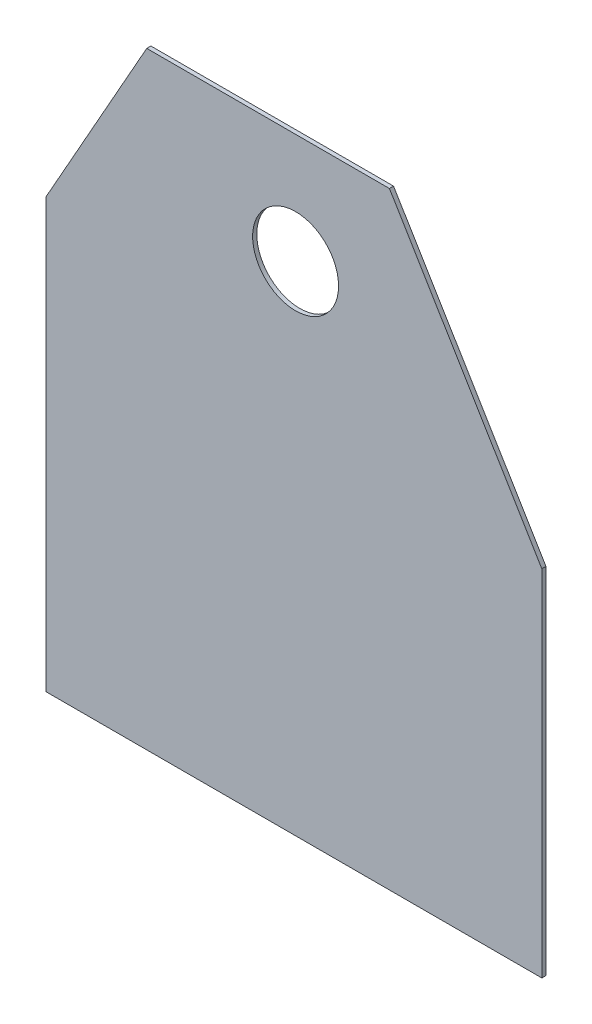
ISO-10303-21;
HEADER;
FILE_DESCRIPTION(('STEP AP214'),'2;1');
FILE_NAME('part.step','',(''),(''),'','','');
FILE_SCHEMA(('AUTOMOTIVE_DESIGN { 1 0 10303 214 1 1 1 1 }'));
ENDSEC;
DATA;
#1=APPLICATION_CONTEXT('core data for automotive mechanical design processes');
#2=APPLICATION_PROTOCOL_DEFINITION('international standard','automotive_design',2000,#1);
#3=PRODUCT_CONTEXT('',#1,'mechanical');
#4=PRODUCT('Part','Part','',(#3));
#5=PRODUCT_RELATED_PRODUCT_CATEGORY('part','',(#4));
#6=PRODUCT_DEFINITION_FORMATION('','',#4);
#7=PRODUCT_DEFINITION_CONTEXT('part definition',#1,'design');
#8=PRODUCT_DEFINITION('design','',#6,#7);
#9=PRODUCT_DEFINITION_SHAPE('','',#8);
#10=(LENGTH_UNIT() NAMED_UNIT(*) SI_UNIT(.MILLI.,.METRE.));
#11=(NAMED_UNIT(*) PLANE_ANGLE_UNIT() SI_UNIT($,.RADIAN.));
#12=(NAMED_UNIT(*) SI_UNIT($,.STERADIAN.) SOLID_ANGLE_UNIT());
#13=UNCERTAINTY_MEASURE_WITH_UNIT(LENGTH_MEASURE(1.E-05),#10,'distance_accuracy_value','');
#14=(GEOMETRIC_REPRESENTATION_CONTEXT(3) GLOBAL_UNCERTAINTY_ASSIGNED_CONTEXT((#13)) GLOBAL_UNIT_ASSIGNED_CONTEXT((#10,
#11,#12)) REPRESENTATION_CONTEXT('',''));
#15=CARTESIAN_POINT('',(0.,0.,0.));
#16=DIRECTION('',(0.,0.,1.));
#17=DIRECTION('',(1.,0.,0.));
#18=AXIS2_PLACEMENT_3D('',#15,#16,#17);
#19=CARTESIAN_POINT('',(3.99997789903306,367.746913543779,2.5));
#20=DIRECTION('',(0.,0.,-1.));
#21=DIRECTION('',(-1.,0.,0.));
#22=AXIS2_PLACEMENT_3D('',#19,#20,#21);
#23=PLANE('',#22);
#24=DIRECTION('',(6.00983079582808E-08,-0.999999999999998,0.));
#25=VECTOR('',#24,1.);
#26=CARTESIAN_POINT('',(4.00000000000009,3.86954190911837E-06,2.5));
#27=LINE('',#26,#25);
#28=CARTESIAN_POINT('',(3.99998440595974,259.475534380179,2.5));
#29=VERTEX_POINT('',#28);
#30=CARTESIAN_POINT('',(4.00000000000009,3.86954190911837E-06,2.5));
#31=VERTEX_POINT('',#30);
#32=EDGE_CURVE('E127',#29,#31,#27,.T.);
#33=ORIENTED_EDGE('',*,*,#32,.T.);
#34=DIRECTION('',(1.,0.,0.));
#35=VECTOR('',#34,1.);
#36=CARTESIAN_POINT('',(4.00000000000009,3.86954190911837E-06,2.5));
#37=LINE('',#36,#35);
#38=CARTESIAN_POINT('',(304.134993214093,3.86954190911837E-06,2.5));
#39=VERTEX_POINT('',#38);
#40=EDGE_CURVE('E85',#31,#39,#37,.T.);
#41=ORIENTED_EDGE('',*,*,#40,.T.);
#42=DIRECTION('',(-6.28185821949425E-08,0.999999999999998,0.));
#43=VECTOR('',#42,1.);
#44=CARTESIAN_POINT('',(304.134993214093,3.86954190911837E-06,2.5));
#45=LINE('',#44,#43);
#46=CARTESIAN_POINT('',(304.134979737587,214.530564139705,2.5));
#47=VERTEX_POINT('',#46);
#48=EDGE_CURVE('E98',#39,#47,#45,.T.);
#49=ORIENTED_EDGE('',*,*,#48,.T.);
#50=DIRECTION('',(-0.515823661860529,0.85669478220939,0.));
#51=VECTOR('',#50,1.);
#52=CARTESIAN_POINT('',(211.88202676087,367.746923337921,2.5));
#53=LINE('',#52,#51);
#54=CARTESIAN_POINT('',(211.88202676087,367.746923337921,2.5));
#55=VERTEX_POINT('',#54);
#56=EDGE_CURVE('E92',#47,#55,#53,.T.);
#57=ORIENTED_EDGE('',*,*,#56,.T.);
#58=DIRECTION('',(-0.999999999999999,-4.71139368803133E-08,0.));
#59=VECTOR('',#58,1.);
#60=CARTESIAN_POINT('',(64.9764614058707,367.746916416621,2.5));
#61=LINE('',#60,#59);
#62=CARTESIAN_POINT('',(64.9764614058707,367.746916416621,2.5));
#63=VERTEX_POINT('',#62);
#64=EDGE_CURVE('E96',#55,#63,#61,.T.);
#65=ORIENTED_EDGE('',*,*,#64,.T.);
#66=DIRECTION('',(-0.49071248496119,-0.871321557809294,0.));
#67=VECTOR('',#66,1.);
#68=CARTESIAN_POINT('',(64.9764614058707,367.746916416621,2.5));
#69=LINE('',#68,#67);
#70=EDGE_CURVE('E48',#63,#29,#69,.T.);
#71=ORIENTED_EDGE('',*,*,#70,.T.);
#72=EDGE_LOOP('',(#33,#41,#49,#57,#65,#71));
#73=FACE_BOUND('',#72,.T.);
#74=CARTESIAN_POINT('',(155.072501178547,301.231243192497,2.5));
#75=DIRECTION('',(0.,0.,1.));
#76=DIRECTION('',(1.,0.,0.));
#77=AXIS2_PLACEMENT_3D('',#74,#75,#76);
#78=CIRCLE('',#77,25.9999999999985);
#79=CARTESIAN_POINT('',(181.072501178546,301.231243192497,2.5));
#80=VERTEX_POINT('',#79);
#81=EDGE_CURVE('E120',#80,#80,#78,.T.);
#82=ORIENTED_EDGE('',*,*,#81,.F.);
#83=EDGE_LOOP('',(#82));
#84=FACE_BOUND('',#83,.T.);
#85=ADVANCED_FACE('F31',(#73,#84),#23,.F.);
#86=CARTESIAN_POINT('',(3.99997789903306,367.746913543779,0.));
#87=DIRECTION('',(0.,0.,-1.));
#88=DIRECTION('',(-1.,0.,0.));
#89=AXIS2_PLACEMENT_3D('',#86,#87,#88);
#90=PLANE('',#89);
#91=DIRECTION('',(6.00983079582808E-08,-0.999999999999998,0.));
#92=VECTOR('',#91,1.);
#93=CARTESIAN_POINT('',(4.00000000000009,3.86954190911837E-06,0.));
#94=LINE('',#93,#92);
#95=CARTESIAN_POINT('',(3.99998440595974,259.475534380179,0.));
#96=VERTEX_POINT('',#95);
#97=CARTESIAN_POINT('',(4.00000000000009,3.86954190911837E-06,0.));
#98=VERTEX_POINT('',#97);
#99=EDGE_CURVE('E116',#96,#98,#94,.T.);
#100=ORIENTED_EDGE('',*,*,#99,.F.);
#101=DIRECTION('',(-0.49071248496119,-0.871321557809294,0.));
#102=VECTOR('',#101,1.);
#103=CARTESIAN_POINT('',(64.9764614058707,367.746916416621,0.));
#104=LINE('',#103,#102);
#105=CARTESIAN_POINT('',(64.9764614058707,367.746916416621,0.));
#106=VERTEX_POINT('',#105);
#107=EDGE_CURVE('E77',#106,#96,#104,.T.);
#108=ORIENTED_EDGE('',*,*,#107,.F.);
#109=DIRECTION('',(-0.999999999999999,-4.71139368803133E-08,0.));
#110=VECTOR('',#109,1.);
#111=CARTESIAN_POINT('',(64.9764614058707,367.746916416621,0.));
#112=LINE('',#111,#110);
#113=CARTESIAN_POINT('',(211.88202676087,367.746923337921,0.));
#114=VERTEX_POINT('',#113);
#115=EDGE_CURVE('E71',#114,#106,#112,.T.);
#116=ORIENTED_EDGE('',*,*,#115,.F.);
#117=DIRECTION('',(-0.515823661860529,0.85669478220939,0.));
#118=VECTOR('',#117,1.);
#119=CARTESIAN_POINT('',(211.88202676087,367.746923337921,0.));
#120=LINE('',#119,#118);
#121=CARTESIAN_POINT('',(304.134979737587,214.530564139705,0.));
#122=VERTEX_POINT('',#121);
#123=EDGE_CURVE('E106',#122,#114,#120,.T.);
#124=ORIENTED_EDGE('',*,*,#123,.F.);
#125=DIRECTION('',(-6.28185821949425E-08,0.999999999999998,0.));
#126=VECTOR('',#125,1.);
#127=CARTESIAN_POINT('',(304.134993214093,3.86954190911837E-06,0.));
#128=LINE('',#127,#126);
#129=CARTESIAN_POINT('',(304.134993214093,3.86954190911837E-06,0.));
#130=VERTEX_POINT('',#129);
#131=EDGE_CURVE('E122',#130,#122,#128,.T.);
#132=ORIENTED_EDGE('',*,*,#131,.F.);
#133=DIRECTION('',(1.,0.,0.));
#134=VECTOR('',#133,1.);
#135=CARTESIAN_POINT('',(4.00000000000009,3.86954190911837E-06,0.));
#136=LINE('',#135,#134);
#137=EDGE_CURVE('E119',#98,#130,#136,.T.);
#138=ORIENTED_EDGE('',*,*,#137,.F.);
#139=EDGE_LOOP('',(#100,#108,#116,#124,#132,#138));
#140=FACE_BOUND('',#139,.T.);
#141=CARTESIAN_POINT('',(155.072501178547,301.231243192497,0.));
#142=DIRECTION('',(0.,0.,1.));
#143=DIRECTION('',(1.,0.,0.));
#144=AXIS2_PLACEMENT_3D('',#141,#142,#143);
#145=CIRCLE('',#144,25.9999999999985);
#146=CARTESIAN_POINT('',(181.072501178546,301.231243192497,0.));
#147=VERTEX_POINT('',#146);
#148=EDGE_CURVE('E220',#147,#147,#145,.T.);
#149=ORIENTED_EDGE('',*,*,#148,.T.);
#150=EDGE_LOOP('',(#149));
#151=FACE_BOUND('',#150,.T.);
#152=ADVANCED_FACE('F136',(#140,#151),#90,.T.);
#153=CARTESIAN_POINT('',(4.00000000000009,3.86954190911837E-06,2.5));
#154=DIRECTION('',(0.999999999999998,6.00983079582808E-08,0.));
#155=DIRECTION('',(-6.00983079582808E-08,0.999999999999998,0.));
#156=AXIS2_PLACEMENT_3D('',#153,#154,#155);
#157=PLANE('',#156);
#158=ORIENTED_EDGE('',*,*,#99,.T.);
#159=DIRECTION('',(0.,0.,-1.));
#160=VECTOR('',#159,1.);
#161=CARTESIAN_POINT('',(4.00000000000009,3.86954190911837E-06,2.5));
#162=LINE('',#161,#160);
#163=EDGE_CURVE('E11',#31,#98,#162,.T.);
#164=ORIENTED_EDGE('',*,*,#163,.F.);
#165=ORIENTED_EDGE('',*,*,#32,.F.);
#166=DIRECTION('',(0.,0.,-1.));
#167=VECTOR('',#166,1.);
#168=CARTESIAN_POINT('',(3.99998440595974,259.475534380179,2.5));
#169=LINE('',#168,#167);
#170=EDGE_CURVE('E112',#29,#96,#169,.T.);
#171=ORIENTED_EDGE('',*,*,#170,.T.);
#172=EDGE_LOOP('',(#158,#164,#165,#171));
#173=FACE_BOUND('',#172,.T.);
#174=ADVANCED_FACE('F33',(#173),#157,.F.);
#175=CARTESIAN_POINT('',(4.00000000000009,3.86954190911837E-06,2.5));
#176=DIRECTION('',(0.,1.,0.));
#177=DIRECTION('',(0.,0.,1.));
#178=AXIS2_PLACEMENT_3D('',#175,#176,#177);
#179=PLANE('',#178);
#180=ORIENTED_EDGE('',*,*,#137,.T.);
#181=DIRECTION('',(0.,0.,-1.));
#182=VECTOR('',#181,1.);
#183=CARTESIAN_POINT('',(304.134993214093,3.86954190911837E-06,2.5));
#184=LINE('',#183,#182);
#185=EDGE_CURVE('E40',#39,#130,#184,.T.);
#186=ORIENTED_EDGE('',*,*,#185,.F.);
#187=ORIENTED_EDGE('',*,*,#40,.F.);
#188=ORIENTED_EDGE('',*,*,#163,.T.);
#189=EDGE_LOOP('',(#180,#186,#187,#188));
#190=FACE_BOUND('',#189,.T.);
#191=ADVANCED_FACE('F161',(#190),#179,.F.);
#192=CARTESIAN_POINT('',(304.134993214093,3.86954190911837E-06,2.5));
#193=DIRECTION('',(-0.999999999999998,-6.28185821949426E-08,0.));
#194=DIRECTION('',(6.28185821949426E-08,-0.999999999999998,0.));
#195=AXIS2_PLACEMENT_3D('',#192,#193,#194);
#196=PLANE('',#195);
#197=ORIENTED_EDGE('',*,*,#131,.T.);
#198=DIRECTION('',(0.,0.,-1.));
#199=VECTOR('',#198,1.);
#200=CARTESIAN_POINT('',(304.134979737587,214.530564139705,2.5));
#201=LINE('',#200,#199);
#202=EDGE_CURVE('E107',#47,#122,#201,.T.);
#203=ORIENTED_EDGE('',*,*,#202,.F.);
#204=ORIENTED_EDGE('',*,*,#48,.F.);
#205=ORIENTED_EDGE('',*,*,#185,.T.);
#206=EDGE_LOOP('',(#197,#203,#204,#205));
#207=FACE_BOUND('',#206,.T.);
#208=ADVANCED_FACE('F133',(#207),#196,.F.);
#209=CARTESIAN_POINT('',(211.88202676087,367.746923337921,2.5));
#210=DIRECTION('',(-0.856694782209391,-0.515823661860529,0.));
#211=DIRECTION('',(0.515823661860529,-0.856694782209391,0.));
#212=AXIS2_PLACEMENT_3D('',#209,#210,#211);
#213=PLANE('',#212);
#214=ORIENTED_EDGE('',*,*,#123,.T.);
#215=DIRECTION('',(0.,0.,-1.));
#216=VECTOR('',#215,1.);
#217=CARTESIAN_POINT('',(211.88202676087,367.746923337921,2.5));
#218=LINE('',#217,#216);
#219=EDGE_CURVE('E103',#55,#114,#218,.T.);
#220=ORIENTED_EDGE('',*,*,#219,.F.);
#221=ORIENTED_EDGE('',*,*,#56,.F.);
#222=ORIENTED_EDGE('',*,*,#202,.T.);
#223=EDGE_LOOP('',(#214,#220,#221,#222));
#224=FACE_BOUND('',#223,.T.);
#225=ADVANCED_FACE('F104',(#224),#213,.F.);
#226=CARTESIAN_POINT('',(64.9764614058707,367.746916416621,2.5));
#227=DIRECTION('',(4.71139368803133E-08,-0.999999999999999,0.));
#228=DIRECTION('',(0.999999999999999,4.71139368803133E-08,0.));
#229=AXIS2_PLACEMENT_3D('',#226,#227,#228);
#230=PLANE('',#229);
#231=ORIENTED_EDGE('',*,*,#115,.T.);
#232=DIRECTION('',(0.,0.,-1.));
#233=VECTOR('',#232,1.);
#234=CARTESIAN_POINT('',(64.9764614058707,367.746916416621,2.5));
#235=LINE('',#234,#233);
#236=EDGE_CURVE('E108',#63,#106,#235,.T.);
#237=ORIENTED_EDGE('',*,*,#236,.F.);
#238=ORIENTED_EDGE('',*,*,#64,.F.);
#239=ORIENTED_EDGE('',*,*,#219,.T.);
#240=EDGE_LOOP('',(#231,#237,#238,#239));
#241=FACE_BOUND('',#240,.T.);
#242=ADVANCED_FACE('F110',(#241),#230,.F.);
#243=CARTESIAN_POINT('',(64.9764614058707,367.746916416621,2.5));
#244=DIRECTION('',(0.871321557809294,-0.49071248496119,0.));
#245=DIRECTION('',(0.49071248496119,0.871321557809294,0.));
#246=AXIS2_PLACEMENT_3D('',#243,#244,#245);
#247=PLANE('',#246);
#248=ORIENTED_EDGE('',*,*,#107,.T.);
#249=ORIENTED_EDGE('',*,*,#170,.F.);
#250=ORIENTED_EDGE('',*,*,#70,.F.);
#251=ORIENTED_EDGE('',*,*,#236,.T.);
#252=EDGE_LOOP('',(#248,#249,#250,#251));
#253=FACE_BOUND('',#252,.T.);
#254=ADVANCED_FACE('F141',(#253),#247,.F.);
#255=CARTESIAN_POINT('',(155.072501178547,301.231243192497,2.5));
#256=DIRECTION('',(0.,0.,-1.));
#257=DIRECTION('',(-1.,0.,0.));
#258=AXIS2_PLACEMENT_3D('',#255,#256,#257);
#259=CYLINDRICAL_SURFACE('',#258,25.9999999999985);
#260=ORIENTED_EDGE('',*,*,#81,.T.);
#261=EDGE_LOOP('',(#260));
#262=FACE_BOUND('',#261,.T.);
#263=ORIENTED_EDGE('',*,*,#148,.F.);
#264=EDGE_LOOP('',(#263));
#265=FACE_BOUND('',#264,.T.);
#266=ADVANCED_FACE('F143',(#262,#265),#259,.F.);
#267=CLOSED_SHELL('',(#85,#152,#174,#191,#208,#225,#242,#254,#266));
#268=MANIFOLD_SOLID_BREP('B2',#267);
#269=ADVANCED_BREP_SHAPE_REPRESENTATION('',(#18,#268),#14);
#270=SHAPE_DEFINITION_REPRESENTATION(#9,#269);
ENDSEC;
END-ISO-10303-21;
